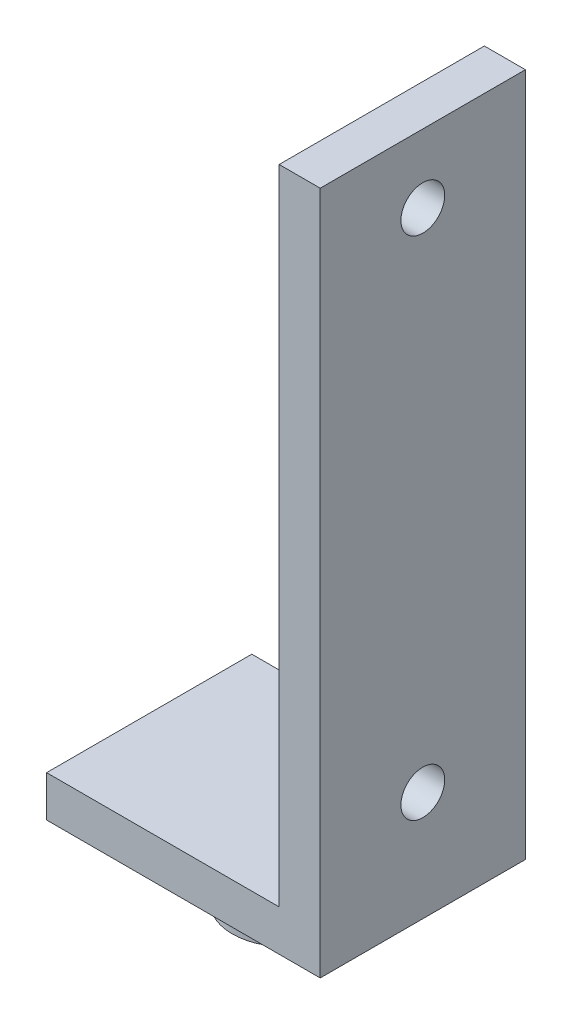
ISO-10303-21;
HEADER;
FILE_DESCRIPTION(('STEP AP214'),'2;1');
FILE_NAME('part.step','',(''),(''),'','','');
FILE_SCHEMA(('AUTOMOTIVE_DESIGN { 1 0 10303 214 1 1 1 1 }'));
ENDSEC;
DATA;
#1=APPLICATION_CONTEXT('core data for automotive mechanical design processes');
#2=APPLICATION_PROTOCOL_DEFINITION('international standard','automotive_design',2000,#1);
#3=PRODUCT_CONTEXT('',#1,'mechanical');
#4=PRODUCT('Part','Part','',(#3));
#5=PRODUCT_RELATED_PRODUCT_CATEGORY('part','',(#4));
#6=PRODUCT_DEFINITION_FORMATION('','',#4);
#7=PRODUCT_DEFINITION_CONTEXT('part definition',#1,'design');
#8=PRODUCT_DEFINITION('design','',#6,#7);
#9=PRODUCT_DEFINITION_SHAPE('','',#8);
#10=(LENGTH_UNIT() NAMED_UNIT(*) SI_UNIT(.MILLI.,.METRE.));
#11=(NAMED_UNIT(*) PLANE_ANGLE_UNIT() SI_UNIT($,.RADIAN.));
#12=(NAMED_UNIT(*) SI_UNIT($,.STERADIAN.) SOLID_ANGLE_UNIT());
#13=UNCERTAINTY_MEASURE_WITH_UNIT(LENGTH_MEASURE(1.E-05),#10,'distance_accuracy_value','');
#14=(GEOMETRIC_REPRESENTATION_CONTEXT(3) GLOBAL_UNCERTAINTY_ASSIGNED_CONTEXT((#13)) GLOBAL_UNIT_ASSIGNED_CONTEXT((#10,
#11,#12)) REPRESENTATION_CONTEXT('',''));
#15=CARTESIAN_POINT('',(0.,0.,0.));
#16=DIRECTION('',(0.,0.,1.));
#17=DIRECTION('',(1.,0.,0.));
#18=AXIS2_PLACEMENT_3D('',#15,#16,#17);
#19=CARTESIAN_POINT('',(0.,7.,0.));
#20=DIRECTION('',(0.,-1.,0.));
#21=DIRECTION('',(0.,0.,-1.));
#22=AXIS2_PLACEMENT_3D('',#19,#20,#21);
#23=PLANE('',#22);
#24=DIRECTION('',(0.,0.,1.));
#25=VECTOR('',#24,1.);
#26=CARTESIAN_POINT('',(7.,7.,0.));
#27=LINE('',#26,#25);
#28=CARTESIAN_POINT('',(7.,7.,-7.5));
#29=VERTEX_POINT('',#28);
#30=CARTESIAN_POINT('',(7.,7.,7.5));
#31=VERTEX_POINT('',#30);
#32=EDGE_CURVE('E67',#29,#31,#27,.T.);
#33=ORIENTED_EDGE('',*,*,#32,.F.);
#34=DIRECTION('',(-1.,0.,0.));
#35=VECTOR('',#34,1.);
#36=CARTESIAN_POINT('',(-10.,7.,-7.5));
#37=LINE('',#36,#35);
#38=CARTESIAN_POINT('',(-10.,7.,-7.5));
#39=VERTEX_POINT('',#38);
#40=EDGE_CURVE('E106',#29,#39,#37,.T.);
#41=ORIENTED_EDGE('',*,*,#40,.T.);
#42=DIRECTION('',(0.,0.,1.));
#43=VECTOR('',#42,1.);
#44=CARTESIAN_POINT('',(-10.,7.,7.5));
#45=LINE('',#44,#43);
#46=CARTESIAN_POINT('',(-10.,7.,7.5));
#47=VERTEX_POINT('',#46);
#48=EDGE_CURVE('E147',#39,#47,#45,.T.);
#49=ORIENTED_EDGE('',*,*,#48,.T.);
#50=DIRECTION('',(1.,0.,0.));
#51=VECTOR('',#50,1.);
#52=CARTESIAN_POINT('',(-10.,7.,7.5));
#53=LINE('',#52,#51);
#54=EDGE_CURVE('E63',#47,#31,#53,.T.);
#55=ORIENTED_EDGE('',*,*,#54,.T.);
#56=EDGE_LOOP('',(#33,#41,#49,#55));
#57=FACE_BOUND('',#56,.T.);
#58=ADVANCED_FACE('F45',(#57),#23,.F.);
#59=CARTESIAN_POINT('',(0.,4.,0.));
#60=DIRECTION('',(0.,-1.,0.));
#61=DIRECTION('',(0.,0.,-1.));
#62=AXIS2_PLACEMENT_3D('',#59,#60,#61);
#63=CYLINDRICAL_SURFACE('',#62,2.924999992);
#64=CARTESIAN_POINT('',(0.,4.,0.));
#65=DIRECTION('',(0.,1.,0.));
#66=DIRECTION('',(0.,0.,1.));
#67=AXIS2_PLACEMENT_3D('',#64,#65,#66);
#68=CIRCLE('',#67,2.924999992);
#69=CARTESIAN_POINT('',(0.,4.,2.924999992));
#70=VERTEX_POINT('',#69);
#71=EDGE_CURVE('E179',#70,#70,#68,.T.);
#72=ORIENTED_EDGE('',*,*,#71,.T.);
#73=EDGE_LOOP('',(#72));
#74=FACE_BOUND('',#73,.T.);
#75=CARTESIAN_POINT('',(0.,0.,0.));
#76=DIRECTION('',(0.,1.,0.));
#77=DIRECTION('',(0.,0.,1.));
#78=AXIS2_PLACEMENT_3D('',#75,#76,#77);
#79=CIRCLE('',#78,2.924999992);
#80=CARTESIAN_POINT('',(0.,0.,2.924999992));
#81=VERTEX_POINT('',#80);
#82=EDGE_CURVE('E182',#81,#81,#79,.T.);
#83=ORIENTED_EDGE('',*,*,#82,.F.);
#84=EDGE_LOOP('',(#83));
#85=FACE_BOUND('',#84,.T.);
#86=ADVANCED_FACE('F47',(#74,#85),#63,.F.);
#87=CARTESIAN_POINT('',(0.,4.,0.));
#88=DIRECTION('',(0.,-1.,0.));
#89=DIRECTION('',(0.,0.,-1.));
#90=AXIS2_PLACEMENT_3D('',#87,#88,#89);
#91=CYLINDRICAL_SURFACE('',#90,3.925);
#92=CARTESIAN_POINT('',(0.,4.,0.));
#93=DIRECTION('',(0.,1.,0.));
#94=DIRECTION('',(0.,0.,1.));
#95=AXIS2_PLACEMENT_3D('',#92,#93,#94);
#96=CIRCLE('',#95,3.925);
#97=CARTESIAN_POINT('',(0.,4.,3.925));
#98=VERTEX_POINT('',#97);
#99=EDGE_CURVE('E12',#98,#98,#96,.T.);
#100=ORIENTED_EDGE('',*,*,#99,.F.);
#101=EDGE_LOOP('',(#100));
#102=FACE_BOUND('',#101,.T.);
#103=CARTESIAN_POINT('',(0.,0.,0.));
#104=DIRECTION('',(0.,1.,0.));
#105=DIRECTION('',(0.,0.,1.));
#106=AXIS2_PLACEMENT_3D('',#103,#104,#105);
#107=CIRCLE('',#106,3.925);
#108=CARTESIAN_POINT('',(0.,0.,3.925));
#109=VERTEX_POINT('',#108);
#110=EDGE_CURVE('E55',#109,#109,#107,.T.);
#111=ORIENTED_EDGE('',*,*,#110,.T.);
#112=EDGE_LOOP('',(#111));
#113=FACE_BOUND('',#112,.T.);
#114=ADVANCED_FACE('F224',(#102,#113),#91,.T.);
#115=CARTESIAN_POINT('',(0.,0.,0.));
#116=DIRECTION('',(0.,1.,0.));
#117=DIRECTION('',(0.,0.,1.));
#118=AXIS2_PLACEMENT_3D('',#115,#116,#117);
#119=PLANE('',#118);
#120=ORIENTED_EDGE('',*,*,#82,.T.);
#121=EDGE_LOOP('',(#120));
#122=FACE_BOUND('',#121,.T.);
#123=ORIENTED_EDGE('',*,*,#110,.F.);
#124=EDGE_LOOP('',(#123));
#125=FACE_BOUND('',#124,.T.);
#126=ADVANCED_FACE('F219',(#122,#125),#119,.F.);
#127=CARTESIAN_POINT('',(0.,4.,0.));
#128=DIRECTION('',(0.,-1.,0.));
#129=DIRECTION('',(0.,0.,-1.));
#130=AXIS2_PLACEMENT_3D('',#127,#128,#129);
#131=PLANE('',#130);
#132=DIRECTION('',(0.,0.,-1.));
#133=VECTOR('',#132,1.);
#134=CARTESIAN_POINT('',(10.,4.,7.5));
#135=LINE('',#134,#133);
#136=CARTESIAN_POINT('',(10.,4.,7.5));
#137=VERTEX_POINT('',#136);
#138=CARTESIAN_POINT('',(10.,4.,-7.5));
#139=VERTEX_POINT('',#138);
#140=EDGE_CURVE('E141',#137,#139,#135,.T.);
#141=ORIENTED_EDGE('',*,*,#140,.F.);
#142=DIRECTION('',(1.,0.,0.));
#143=VECTOR('',#142,1.);
#144=CARTESIAN_POINT('',(-10.,4.,7.5));
#145=LINE('',#144,#143);
#146=CARTESIAN_POINT('',(-10.,4.,7.5));
#147=VERTEX_POINT('',#146);
#148=EDGE_CURVE('E148',#147,#137,#145,.T.);
#149=ORIENTED_EDGE('',*,*,#148,.F.);
#150=DIRECTION('',(0.,0.,1.));
#151=VECTOR('',#150,1.);
#152=CARTESIAN_POINT('',(-10.,4.,7.5));
#153=LINE('',#152,#151);
#154=CARTESIAN_POINT('',(-10.,4.,-7.5));
#155=VERTEX_POINT('',#154);
#156=EDGE_CURVE('E160',#155,#147,#153,.T.);
#157=ORIENTED_EDGE('',*,*,#156,.F.);
#158=DIRECTION('',(-1.,0.,0.));
#159=VECTOR('',#158,1.);
#160=CARTESIAN_POINT('',(-10.,4.,-7.5));
#161=LINE('',#160,#159);
#162=EDGE_CURVE('E157',#139,#155,#161,.T.);
#163=ORIENTED_EDGE('',*,*,#162,.F.);
#164=EDGE_LOOP('',(#141,#149,#157,#163));
#165=FACE_BOUND('',#164,.T.);
#166=ORIENTED_EDGE('',*,*,#99,.T.);
#167=EDGE_LOOP('',(#166));
#168=FACE_BOUND('',#167,.T.);
#169=ADVANCED_FACE('F216',(#165,#168),#131,.T.);
#170=CARTESIAN_POINT('',(-10.,7.,7.5));
#171=DIRECTION('',(0.,0.,-1.));
#172=DIRECTION('',(-1.,0.,0.));
#173=AXIS2_PLACEMENT_3D('',#170,#171,#172);
#174=PLANE('',#173);
#175=DIRECTION('',(0.,-1.,0.));
#176=VECTOR('',#175,1.);
#177=CARTESIAN_POINT('',(10.,7.,7.5));
#178=LINE('',#177,#176);
#179=CARTESIAN_POINT('',(10.,54.,7.5));
#180=VERTEX_POINT('',#179);
#181=EDGE_CURVE('E153',#180,#137,#178,.T.);
#182=ORIENTED_EDGE('',*,*,#181,.F.);
#183=DIRECTION('',(1.,0.,0.));
#184=VECTOR('',#183,1.);
#185=CARTESIAN_POINT('',(7.,54.,7.5));
#186=LINE('',#185,#184);
#187=CARTESIAN_POINT('',(7.,54.,7.5));
#188=VERTEX_POINT('',#187);
#189=EDGE_CURVE('E120',#188,#180,#186,.T.);
#190=ORIENTED_EDGE('',*,*,#189,.F.);
#191=DIRECTION('',(0.,-1.,0.));
#192=VECTOR('',#191,1.);
#193=CARTESIAN_POINT('',(7.,7.,7.5));
#194=LINE('',#193,#192);
#195=EDGE_CURVE('E111',#188,#31,#194,.T.);
#196=ORIENTED_EDGE('',*,*,#195,.T.);
#197=ORIENTED_EDGE('',*,*,#54,.F.);
#198=DIRECTION('',(0.,-1.,0.));
#199=VECTOR('',#198,1.);
#200=CARTESIAN_POINT('',(-10.,7.,7.5));
#201=LINE('',#200,#199);
#202=EDGE_CURVE('E168',#47,#147,#201,.T.);
#203=ORIENTED_EDGE('',*,*,#202,.T.);
#204=ORIENTED_EDGE('',*,*,#148,.T.);
#205=EDGE_LOOP('',(#182,#190,#196,#197,#203,#204));
#206=FACE_BOUND('',#205,.T.);
#207=ADVANCED_FACE('F205',(#206),#174,.F.);
#208=CARTESIAN_POINT('',(-10.,7.,7.5));
#209=DIRECTION('',(1.,0.,0.));
#210=DIRECTION('',(0.,0.,-1.));
#211=AXIS2_PLACEMENT_3D('',#208,#209,#210);
#212=PLANE('',#211);
#213=ORIENTED_EDGE('',*,*,#156,.T.);
#214=ORIENTED_EDGE('',*,*,#202,.F.);
#215=ORIENTED_EDGE('',*,*,#48,.F.);
#216=DIRECTION('',(0.,-1.,0.));
#217=VECTOR('',#216,1.);
#218=CARTESIAN_POINT('',(-10.,7.,-7.5));
#219=LINE('',#218,#217);
#220=EDGE_CURVE('E172',#39,#155,#219,.T.);
#221=ORIENTED_EDGE('',*,*,#220,.T.);
#222=EDGE_LOOP('',(#213,#214,#215,#221));
#223=FACE_BOUND('',#222,.T.);
#224=ADVANCED_FACE('F213',(#223),#212,.F.);
#225=CARTESIAN_POINT('',(-10.,7.,-7.5));
#226=DIRECTION('',(0.,0.,1.));
#227=DIRECTION('',(1.,0.,0.));
#228=AXIS2_PLACEMENT_3D('',#225,#226,#227);
#229=PLANE('',#228);
#230=ORIENTED_EDGE('',*,*,#162,.T.);
#231=ORIENTED_EDGE('',*,*,#220,.F.);
#232=ORIENTED_EDGE('',*,*,#40,.F.);
#233=DIRECTION('',(0.,1.,0.));
#234=VECTOR('',#233,1.);
#235=CARTESIAN_POINT('',(7.,7.,-7.5));
#236=LINE('',#235,#234);
#237=CARTESIAN_POINT('',(7.,54.,-7.5));
#238=VERTEX_POINT('',#237);
#239=EDGE_CURVE('E99',#29,#238,#236,.T.);
#240=ORIENTED_EDGE('',*,*,#239,.T.);
#241=DIRECTION('',(1.,0.,0.));
#242=VECTOR('',#241,1.);
#243=CARTESIAN_POINT('',(7.,54.,-7.5));
#244=LINE('',#243,#242);
#245=CARTESIAN_POINT('',(10.,54.,-7.5));
#246=VERTEX_POINT('',#245);
#247=EDGE_CURVE('E103',#238,#246,#244,.T.);
#248=ORIENTED_EDGE('',*,*,#247,.T.);
#249=DIRECTION('',(0.,-1.,0.));
#250=VECTOR('',#249,1.);
#251=CARTESIAN_POINT('',(10.,7.,-7.5));
#252=LINE('',#251,#250);
#253=EDGE_CURVE('E176',#246,#139,#252,.T.);
#254=ORIENTED_EDGE('',*,*,#253,.T.);
#255=EDGE_LOOP('',(#230,#231,#232,#240,#248,#254));
#256=FACE_BOUND('',#255,.T.);
#257=ADVANCED_FACE('F101',(#256),#229,.F.);
#258=CARTESIAN_POINT('',(10.,7.,7.5));
#259=DIRECTION('',(-1.,0.,0.));
#260=DIRECTION('',(0.,0.,1.));
#261=AXIS2_PLACEMENT_3D('',#258,#259,#260);
#262=PLANE('',#261);
#263=CARTESIAN_POINT('',(10.,12.,0.));
#264=DIRECTION('',(1.,0.,0.));
#265=DIRECTION('',(0.,0.,-1.));
#266=AXIS2_PLACEMENT_3D('',#263,#264,#265);
#267=CIRCLE('',#266,1.59999999999999);
#268=CARTESIAN_POINT('',(10.,12.,-1.59999999999999));
#269=VERTEX_POINT('',#268);
#270=EDGE_CURVE('E201',#269,#269,#267,.T.);
#271=ORIENTED_EDGE('',*,*,#270,.F.);
#272=EDGE_LOOP('',(#271));
#273=FACE_BOUND('',#272,.T.);
#274=CARTESIAN_POINT('',(10.,49.,0.));
#275=DIRECTION('',(1.,0.,0.));
#276=DIRECTION('',(0.,0.,-1.));
#277=AXIS2_PLACEMENT_3D('',#274,#275,#276);
#278=CIRCLE('',#277,1.59999999999999);
#279=CARTESIAN_POINT('',(10.,49.,-1.59999999999999));
#280=VERTEX_POINT('',#279);
#281=EDGE_CURVE('E191',#280,#280,#278,.T.);
#282=ORIENTED_EDGE('',*,*,#281,.F.);
#283=EDGE_LOOP('',(#282));
#284=FACE_BOUND('',#283,.T.);
#285=ORIENTED_EDGE('',*,*,#140,.T.);
#286=ORIENTED_EDGE('',*,*,#253,.F.);
#287=DIRECTION('',(0.,0.,1.));
#288=VECTOR('',#287,1.);
#289=CARTESIAN_POINT('',(10.,54.,7.5));
#290=LINE('',#289,#288);
#291=EDGE_CURVE('E118',#246,#180,#290,.T.);
#292=ORIENTED_EDGE('',*,*,#291,.T.);
#293=ORIENTED_EDGE('',*,*,#181,.T.);
#294=EDGE_LOOP('',(#285,#286,#292,#293));
#295=FACE_BOUND('',#294,.T.);
#296=ADVANCED_FACE('F207',(#273,#284,#295),#262,.F.);
#297=CARTESIAN_POINT('',(0.,4.,0.));
#298=DIRECTION('',(0.,1.,0.));
#299=DIRECTION('',(0.,0.,1.));
#300=AXIS2_PLACEMENT_3D('',#297,#298,#299);
#301=CIRCLE('',#300,0.875000000000001);
#302=CARTESIAN_POINT('',(0.,4.,0.875000000000001));
#303=VERTEX_POINT('',#302);
#304=EDGE_CURVE('E137',#303,#303,#301,.T.);
#305=ORIENTED_EDGE('',*,*,#304,.T.);
#306=EDGE_LOOP('',(#305));
#307=FACE_BOUND('',#306,.T.);
#308=ORIENTED_EDGE('',*,*,#71,.F.);
#309=EDGE_LOOP('',(#308));
#310=FACE_BOUND('',#309,.T.);
#311=ADVANCED_FACE('F221',(#307,#310),#131,.T.);
#312=CARTESIAN_POINT('',(0.,4.,0.));
#313=DIRECTION('',(0.,-1.,0.));
#314=DIRECTION('',(0.,0.,-1.));
#315=AXIS2_PLACEMENT_3D('',#312,#313,#314);
#316=CYLINDRICAL_SURFACE('',#315,0.875000000000001);
#317=ORIENTED_EDGE('',*,*,#304,.F.);
#318=EDGE_LOOP('',(#317));
#319=FACE_BOUND('',#318,.T.);
#320=CARTESIAN_POINT('',(0.,0.,0.));
#321=DIRECTION('',(0.,1.,0.));
#322=DIRECTION('',(0.,0.,1.));
#323=AXIS2_PLACEMENT_3D('',#320,#321,#322);
#324=CIRCLE('',#323,0.875000000000001);
#325=CARTESIAN_POINT('',(0.,0.,0.875000000000001));
#326=VERTEX_POINT('',#325);
#327=EDGE_CURVE('E136',#326,#326,#324,.T.);
#328=ORIENTED_EDGE('',*,*,#327,.T.);
#329=EDGE_LOOP('',(#328));
#330=FACE_BOUND('',#329,.T.);
#331=ADVANCED_FACE('F242',(#319,#330),#316,.T.);
#332=CARTESIAN_POINT('',(0.,0.,0.));
#333=DIRECTION('',(0.,1.,0.));
#334=DIRECTION('',(0.,0.,1.));
#335=AXIS2_PLACEMENT_3D('',#332,#333,#334);
#336=PLANE('',#335);
#337=ORIENTED_EDGE('',*,*,#327,.F.);
#338=EDGE_LOOP('',(#337));
#339=FACE_BOUND('',#338,.T.);
#340=ADVANCED_FACE('F269',(#339),#336,.F.);
#341=CARTESIAN_POINT('',(7.,0.,0.));
#342=DIRECTION('',(1.,0.,0.));
#343=DIRECTION('',(0.,0.,-1.));
#344=AXIS2_PLACEMENT_3D('',#341,#342,#343);
#345=PLANE('',#344);
#346=CARTESIAN_POINT('',(7.,12.,0.));
#347=DIRECTION('',(1.,0.,0.));
#348=DIRECTION('',(0.,0.,-1.));
#349=AXIS2_PLACEMENT_3D('',#346,#347,#348);
#350=CIRCLE('',#349,1.59999999999999);
#351=CARTESIAN_POINT('',(7.,12.,-1.59999999999999));
#352=VERTEX_POINT('',#351);
#353=EDGE_CURVE('E49',#352,#352,#350,.T.);
#354=ORIENTED_EDGE('',*,*,#353,.T.);
#355=EDGE_LOOP('',(#354));
#356=FACE_BOUND('',#355,.T.);
#357=CARTESIAN_POINT('',(7.,49.,0.));
#358=DIRECTION('',(1.,0.,0.));
#359=DIRECTION('',(0.,0.,-1.));
#360=AXIS2_PLACEMENT_3D('',#357,#358,#359);
#361=CIRCLE('',#360,1.59999999999999);
#362=CARTESIAN_POINT('',(7.,49.,-1.59999999999999));
#363=VERTEX_POINT('',#362);
#364=EDGE_CURVE('E131',#363,#363,#361,.T.);
#365=ORIENTED_EDGE('',*,*,#364,.T.);
#366=EDGE_LOOP('',(#365));
#367=FACE_BOUND('',#366,.T.);
#368=ORIENTED_EDGE('',*,*,#239,.F.);
#369=ORIENTED_EDGE('',*,*,#32,.T.);
#370=ORIENTED_EDGE('',*,*,#195,.F.);
#371=DIRECTION('',(0.,0.,1.));
#372=VECTOR('',#371,1.);
#373=CARTESIAN_POINT('',(7.,54.,7.5));
#374=LINE('',#373,#372);
#375=EDGE_CURVE('E110',#238,#188,#374,.T.);
#376=ORIENTED_EDGE('',*,*,#375,.F.);
#377=EDGE_LOOP('',(#368,#369,#370,#376));
#378=FACE_BOUND('',#377,.T.);
#379=ADVANCED_FACE('F123',(#356,#367,#378),#345,.F.);
#380=CARTESIAN_POINT('',(7.,54.,7.5));
#381=DIRECTION('',(0.,1.,0.));
#382=DIRECTION('',(0.,0.,1.));
#383=AXIS2_PLACEMENT_3D('',#380,#381,#382);
#384=PLANE('',#383);
#385=ORIENTED_EDGE('',*,*,#291,.F.);
#386=ORIENTED_EDGE('',*,*,#247,.F.);
#387=ORIENTED_EDGE('',*,*,#375,.T.);
#388=ORIENTED_EDGE('',*,*,#189,.T.);
#389=EDGE_LOOP('',(#385,#386,#387,#388));
#390=FACE_BOUND('',#389,.T.);
#391=ADVANCED_FACE('F115',(#390),#384,.T.);
#392=CARTESIAN_POINT('',(10.,49.,0.));
#393=DIRECTION('',(1.,0.,0.));
#394=DIRECTION('',(0.,0.,-1.));
#395=AXIS2_PLACEMENT_3D('',#392,#393,#394);
#396=CYLINDRICAL_SURFACE('',#395,1.59999999999999);
#397=ORIENTED_EDGE('',*,*,#281,.T.);
#398=EDGE_LOOP('',(#397));
#399=FACE_BOUND('',#398,.T.);
#400=ORIENTED_EDGE('',*,*,#364,.F.);
#401=EDGE_LOOP('',(#400));
#402=FACE_BOUND('',#401,.T.);
#403=ADVANCED_FACE('F264',(#399,#402),#396,.F.);
#404=CARTESIAN_POINT('',(10.,12.,0.));
#405=DIRECTION('',(1.,0.,0.));
#406=DIRECTION('',(0.,0.,-1.));
#407=AXIS2_PLACEMENT_3D('',#404,#405,#406);
#408=CYLINDRICAL_SURFACE('',#407,1.59999999999999);
#409=ORIENTED_EDGE('',*,*,#270,.T.);
#410=EDGE_LOOP('',(#409));
#411=FACE_BOUND('',#410,.T.);
#412=ORIENTED_EDGE('',*,*,#353,.F.);
#413=EDGE_LOOP('',(#412));
#414=FACE_BOUND('',#413,.T.);
#415=ADVANCED_FACE('F261',(#411,#414),#408,.F.);
#416=CLOSED_SHELL('',(#58,#86,#114,#126,#169,#207,#224,#257,#296,#311,#331,#340,#379,#391,#403,#415));
#417=MANIFOLD_SOLID_BREP('B2',#416);
#418=ADVANCED_BREP_SHAPE_REPRESENTATION('',(#18,#417),#14);
#419=SHAPE_DEFINITION_REPRESENTATION(#9,#418);
ENDSEC;
END-ISO-10303-21;
